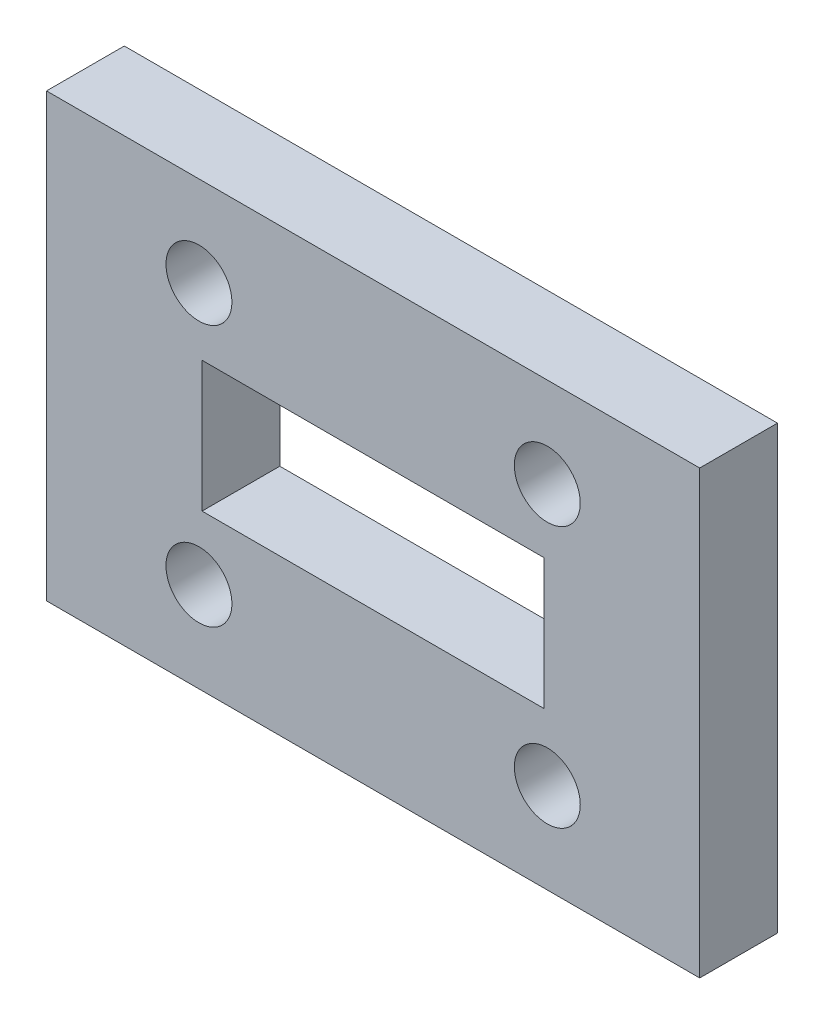
ISO-10303-21;
HEADER;
FILE_DESCRIPTION(('STEP AP214'),'2;1');
FILE_NAME('part.step','',(''),(''),'','','');
FILE_SCHEMA(('AUTOMOTIVE_DESIGN { 1 0 10303 214 1 1 1 1 }'));
ENDSEC;
DATA;
#1=APPLICATION_CONTEXT('core data for automotive mechanical design processes');
#2=APPLICATION_PROTOCOL_DEFINITION('international standard','automotive_design',2000,#1);
#3=PRODUCT_CONTEXT('',#1,'mechanical');
#4=PRODUCT('Part','Part','',(#3));
#5=PRODUCT_RELATED_PRODUCT_CATEGORY('part','',(#4));
#6=PRODUCT_DEFINITION_FORMATION('','',#4);
#7=PRODUCT_DEFINITION_CONTEXT('part definition',#1,'design');
#8=PRODUCT_DEFINITION('design','',#6,#7);
#9=PRODUCT_DEFINITION_SHAPE('','',#8);
#10=(LENGTH_UNIT() NAMED_UNIT(*) SI_UNIT(.MILLI.,.METRE.));
#11=(NAMED_UNIT(*) PLANE_ANGLE_UNIT() SI_UNIT($,.RADIAN.));
#12=(NAMED_UNIT(*) SI_UNIT($,.STERADIAN.) SOLID_ANGLE_UNIT());
#13=UNCERTAINTY_MEASURE_WITH_UNIT(LENGTH_MEASURE(1.E-05),#10,'distance_accuracy_value','');
#14=(GEOMETRIC_REPRESENTATION_CONTEXT(3) GLOBAL_UNCERTAINTY_ASSIGNED_CONTEXT((#13)) GLOBAL_UNIT_ASSIGNED_CONTEXT((#10,
#11,#12)) REPRESENTATION_CONTEXT('',''));
#15=CARTESIAN_POINT('',(0.,0.,0.));
#16=DIRECTION('',(0.,0.,1.));
#17=DIRECTION('',(1.,0.,0.));
#18=AXIS2_PLACEMENT_3D('',#15,#16,#17);
#19=CARTESIAN_POINT('',(0.,0.,3.175));
#20=DIRECTION('',(0.,0.,1.));
#21=DIRECTION('',(1.,0.,0.));
#22=AXIS2_PLACEMENT_3D('',#19,#20,#21);
#23=PLANE('',#22);
#24=CARTESIAN_POINT('',(7.112,-5.334,3.175));
#25=DIRECTION('',(0.,0.,1.));
#26=DIRECTION('',(1.,0.,0.));
#27=AXIS2_PLACEMENT_3D('',#24,#25,#26);
#28=CIRCLE('',#27,1.3462);
#29=CARTESIAN_POINT('',(8.4582,-5.334,3.175));
#30=VERTEX_POINT('',#29);
#31=EDGE_CURVE('E277',#30,#30,#28,.T.);
#32=ORIENTED_EDGE('',*,*,#31,.F.);
#33=EDGE_LOOP('',(#32));
#34=FACE_BOUND('',#33,.T.);
#35=CARTESIAN_POINT('',(-7.112,5.334,3.175));
#36=DIRECTION('',(0.,0.,1.));
#37=DIRECTION('',(1.,0.,0.));
#38=AXIS2_PLACEMENT_3D('',#35,#36,#37);
#39=CIRCLE('',#38,1.3462);
#40=CARTESIAN_POINT('',(-5.7658,5.334,3.175));
#41=VERTEX_POINT('',#40);
#42=EDGE_CURVE('E140',#41,#41,#39,.T.);
#43=ORIENTED_EDGE('',*,*,#42,.F.);
#44=EDGE_LOOP('',(#43));
#45=FACE_BOUND('',#44,.T.);
#46=DIRECTION('',(0.,-1.,0.));
#47=VECTOR('',#46,1.);
#48=CARTESIAN_POINT('',(-13.335,-9.017,3.175));
#49=LINE('',#48,#47);
#50=CARTESIAN_POINT('',(-13.335,9.017,3.175));
#51=VERTEX_POINT('',#50);
#52=CARTESIAN_POINT('',(-13.335,-9.017,3.175));
#53=VERTEX_POINT('',#52);
#54=EDGE_CURVE('E156',#51,#53,#49,.T.);
#55=ORIENTED_EDGE('',*,*,#54,.T.);
#56=DIRECTION('',(1.,0.,0.));
#57=VECTOR('',#56,1.);
#58=CARTESIAN_POINT('',(13.335,-9.01699999999999,3.175));
#59=LINE('',#58,#57);
#60=CARTESIAN_POINT('',(13.335,-9.01699999999999,3.175));
#61=VERTEX_POINT('',#60);
#62=EDGE_CURVE('E160',#53,#61,#59,.T.);
#63=ORIENTED_EDGE('',*,*,#62,.T.);
#64=DIRECTION('',(0.,1.,0.));
#65=VECTOR('',#64,1.);
#66=CARTESIAN_POINT('',(13.335,-9.01699999999999,3.175));
#67=LINE('',#66,#65);
#68=CARTESIAN_POINT('',(13.335,9.01699999999999,3.175));
#69=VERTEX_POINT('',#68);
#70=EDGE_CURVE('E164',#61,#69,#67,.T.);
#71=ORIENTED_EDGE('',*,*,#70,.T.);
#72=DIRECTION('',(-1.,0.,0.));
#73=VECTOR('',#72,1.);
#74=CARTESIAN_POINT('',(13.335,9.01699999999999,3.175));
#75=LINE('',#74,#73);
#76=EDGE_CURVE('E167',#69,#51,#75,.T.);
#77=ORIENTED_EDGE('',*,*,#76,.T.);
#78=EDGE_LOOP('',(#55,#63,#71,#77));
#79=FACE_BOUND('',#78,.T.);
#80=DIRECTION('',(1.,0.,0.));
#81=VECTOR('',#80,1.);
#82=CARTESIAN_POINT('',(6.985,-2.667,3.175));
#83=LINE('',#82,#81);
#84=CARTESIAN_POINT('',(-6.985,-2.667,3.175));
#85=VERTEX_POINT('',#84);
#86=CARTESIAN_POINT('',(6.985,-2.667,3.175));
#87=VERTEX_POINT('',#86);
#88=EDGE_CURVE('E114',#85,#87,#83,.T.);
#89=ORIENTED_EDGE('',*,*,#88,.F.);
#90=DIRECTION('',(0.,-1.,0.));
#91=VECTOR('',#90,1.);
#92=CARTESIAN_POINT('',(-6.985,-2.667,3.175));
#93=LINE('',#92,#91);
#94=CARTESIAN_POINT('',(-6.985,2.667,3.175));
#95=VERTEX_POINT('',#94);
#96=EDGE_CURVE('E105',#95,#85,#93,.T.);
#97=ORIENTED_EDGE('',*,*,#96,.F.);
#98=DIRECTION('',(-1.,0.,0.));
#99=VECTOR('',#98,1.);
#100=CARTESIAN_POINT('',(6.985,2.667,3.175));
#101=LINE('',#100,#99);
#102=CARTESIAN_POINT('',(6.985,2.667,3.175));
#103=VERTEX_POINT('',#102);
#104=EDGE_CURVE('E132',#103,#95,#101,.T.);
#105=ORIENTED_EDGE('',*,*,#104,.F.);
#106=DIRECTION('',(0.,1.,0.));
#107=VECTOR('',#106,1.);
#108=CARTESIAN_POINT('',(6.985,-2.667,3.175));
#109=LINE('',#108,#107);
#110=EDGE_CURVE('E128',#87,#103,#109,.T.);
#111=ORIENTED_EDGE('',*,*,#110,.F.);
#112=EDGE_LOOP('',(#89,#97,#105,#111));
#113=FACE_BOUND('',#112,.T.);
#114=CARTESIAN_POINT('',(7.112,5.334,3.175));
#115=DIRECTION('',(0.,0.,1.));
#116=DIRECTION('',(-1.,0.,0.));
#117=AXIS2_PLACEMENT_3D('',#114,#115,#116);
#118=CIRCLE('',#117,1.3462);
#119=CARTESIAN_POINT('',(5.7658,5.334,3.175));
#120=VERTEX_POINT('',#119);
#121=EDGE_CURVE('E285',#120,#120,#118,.T.);
#122=ORIENTED_EDGE('',*,*,#121,.F.);
#123=EDGE_LOOP('',(#122));
#124=FACE_BOUND('',#123,.T.);
#125=CARTESIAN_POINT('',(-7.112,-5.334,3.175));
#126=DIRECTION('',(0.,0.,1.));
#127=DIRECTION('',(-1.,0.,0.));
#128=AXIS2_PLACEMENT_3D('',#125,#126,#127);
#129=CIRCLE('',#128,1.3462);
#130=CARTESIAN_POINT('',(-8.4582,-5.334,3.175));
#131=VERTEX_POINT('',#130);
#132=EDGE_CURVE('E266',#131,#131,#129,.T.);
#133=ORIENTED_EDGE('',*,*,#132,.F.);
#134=EDGE_LOOP('',(#133));
#135=FACE_BOUND('',#134,.T.);
#136=ADVANCED_FACE('F39',(#34,#45,#79,#113,#124,#135),#23,.T.);
#137=CARTESIAN_POINT('',(0.,0.,0.));
#138=DIRECTION('',(0.,0.,1.));
#139=DIRECTION('',(1.,0.,0.));
#140=AXIS2_PLACEMENT_3D('',#137,#138,#139);
#141=PLANE('',#140);
#142=DIRECTION('',(0.,-1.,0.));
#143=VECTOR('',#142,1.);
#144=CARTESIAN_POINT('',(-13.335,-9.017,0.));
#145=LINE('',#144,#143);
#146=CARTESIAN_POINT('',(-13.335,9.017,0.));
#147=VERTEX_POINT('',#146);
#148=CARTESIAN_POINT('',(-13.335,-9.017,0.));
#149=VERTEX_POINT('',#148);
#150=EDGE_CURVE('E123',#147,#149,#145,.T.);
#151=ORIENTED_EDGE('',*,*,#150,.F.);
#152=DIRECTION('',(-1.,0.,0.));
#153=VECTOR('',#152,1.);
#154=CARTESIAN_POINT('',(13.335,9.01699999999999,0.));
#155=LINE('',#154,#153);
#156=CARTESIAN_POINT('',(13.335,9.01699999999999,0.));
#157=VERTEX_POINT('',#156);
#158=EDGE_CURVE('E161',#157,#147,#155,.T.);
#159=ORIENTED_EDGE('',*,*,#158,.F.);
#160=DIRECTION('',(0.,1.,0.));
#161=VECTOR('',#160,1.);
#162=CARTESIAN_POINT('',(13.335,-9.01699999999999,0.));
#163=LINE('',#162,#161);
#164=CARTESIAN_POINT('',(13.335,-9.01699999999999,0.));
#165=VERTEX_POINT('',#164);
#166=EDGE_CURVE('E177',#165,#157,#163,.T.);
#167=ORIENTED_EDGE('',*,*,#166,.F.);
#168=DIRECTION('',(1.,0.,0.));
#169=VECTOR('',#168,1.);
#170=CARTESIAN_POINT('',(13.335,-9.01699999999999,0.));
#171=LINE('',#170,#169);
#172=EDGE_CURVE('E174',#149,#165,#171,.T.);
#173=ORIENTED_EDGE('',*,*,#172,.F.);
#174=EDGE_LOOP('',(#151,#159,#167,#173));
#175=FACE_BOUND('',#174,.T.);
#176=DIRECTION('',(0.,-1.,0.));
#177=VECTOR('',#176,1.);
#178=CARTESIAN_POINT('',(-6.985,-2.667,0.));
#179=LINE('',#178,#177);
#180=CARTESIAN_POINT('',(-6.985,2.667,0.));
#181=VERTEX_POINT('',#180);
#182=CARTESIAN_POINT('',(-6.985,-2.667,0.));
#183=VERTEX_POINT('',#182);
#184=EDGE_CURVE('E63',#181,#183,#179,.T.);
#185=ORIENTED_EDGE('',*,*,#184,.T.);
#186=DIRECTION('',(1.,0.,0.));
#187=VECTOR('',#186,1.);
#188=CARTESIAN_POINT('',(6.985,-2.667,0.));
#189=LINE('',#188,#187);
#190=CARTESIAN_POINT('',(6.985,-2.667,0.));
#191=VERTEX_POINT('',#190);
#192=EDGE_CURVE('E121',#183,#191,#189,.T.);
#193=ORIENTED_EDGE('',*,*,#192,.T.);
#194=DIRECTION('',(0.,1.,0.));
#195=VECTOR('',#194,1.);
#196=CARTESIAN_POINT('',(6.985,-2.667,0.));
#197=LINE('',#196,#195);
#198=CARTESIAN_POINT('',(6.985,2.667,0.));
#199=VERTEX_POINT('',#198);
#200=EDGE_CURVE('E143',#191,#199,#197,.T.);
#201=ORIENTED_EDGE('',*,*,#200,.T.);
#202=DIRECTION('',(-1.,0.,0.));
#203=VECTOR('',#202,1.);
#204=CARTESIAN_POINT('',(6.985,2.667,0.));
#205=LINE('',#204,#203);
#206=EDGE_CURVE('E115',#199,#181,#205,.T.);
#207=ORIENTED_EDGE('',*,*,#206,.T.);
#208=EDGE_LOOP('',(#185,#193,#201,#207));
#209=FACE_BOUND('',#208,.T.);
#210=CARTESIAN_POINT('',(-7.112,5.334,0.));
#211=DIRECTION('',(0.,0.,1.));
#212=DIRECTION('',(1.,0.,0.));
#213=AXIS2_PLACEMENT_3D('',#210,#211,#212);
#214=CIRCLE('',#213,1.3462);
#215=CARTESIAN_POINT('',(-5.7658,5.334,0.));
#216=VERTEX_POINT('',#215);
#217=EDGE_CURVE('E289',#216,#216,#214,.T.);
#218=ORIENTED_EDGE('',*,*,#217,.T.);
#219=EDGE_LOOP('',(#218));
#220=FACE_BOUND('',#219,.T.);
#221=CARTESIAN_POINT('',(7.112,5.334,0.));
#222=DIRECTION('',(0.,0.,1.));
#223=DIRECTION('',(-1.,0.,0.));
#224=AXIS2_PLACEMENT_3D('',#221,#222,#223);
#225=CIRCLE('',#224,1.3462);
#226=CARTESIAN_POINT('',(5.7658,5.334,0.));
#227=VERTEX_POINT('',#226);
#228=EDGE_CURVE('E281',#227,#227,#225,.T.);
#229=ORIENTED_EDGE('',*,*,#228,.T.);
#230=EDGE_LOOP('',(#229));
#231=FACE_BOUND('',#230,.T.);
#232=CARTESIAN_POINT('',(7.112,-5.334,0.));
#233=DIRECTION('',(0.,0.,1.));
#234=DIRECTION('',(1.,0.,0.));
#235=AXIS2_PLACEMENT_3D('',#232,#233,#234);
#236=CIRCLE('',#235,1.3462);
#237=CARTESIAN_POINT('',(8.4582,-5.334,0.));
#238=VERTEX_POINT('',#237);
#239=EDGE_CURVE('E274',#238,#238,#236,.T.);
#240=ORIENTED_EDGE('',*,*,#239,.T.);
#241=EDGE_LOOP('',(#240));
#242=FACE_BOUND('',#241,.T.);
#243=CARTESIAN_POINT('',(-7.112,-5.334,0.));
#244=DIRECTION('',(0.,0.,1.));
#245=DIRECTION('',(-1.,0.,0.));
#246=AXIS2_PLACEMENT_3D('',#243,#244,#245);
#247=CIRCLE('',#246,1.3462);
#248=CARTESIAN_POINT('',(-8.4582,-5.334,0.));
#249=VERTEX_POINT('',#248);
#250=EDGE_CURVE('E269',#249,#249,#247,.T.);
#251=ORIENTED_EDGE('',*,*,#250,.T.);
#252=EDGE_LOOP('',(#251));
#253=FACE_BOUND('',#252,.T.);
#254=ADVANCED_FACE('F200',(#175,#209,#220,#231,#242,#253),#141,.F.);
#255=CARTESIAN_POINT('',(-13.335,-9.017,3.175));
#256=DIRECTION('',(1.,0.,0.));
#257=DIRECTION('',(0.,0.,-1.));
#258=AXIS2_PLACEMENT_3D('',#255,#256,#257);
#259=PLANE('',#258);
#260=ORIENTED_EDGE('',*,*,#150,.T.);
#261=DIRECTION('',(0.,0.,-1.));
#262=VECTOR('',#261,1.);
#263=CARTESIAN_POINT('',(-13.335,-9.017,3.175));
#264=LINE('',#263,#262);
#265=EDGE_CURVE('E11',#53,#149,#264,.T.);
#266=ORIENTED_EDGE('',*,*,#265,.F.);
#267=ORIENTED_EDGE('',*,*,#54,.F.);
#268=DIRECTION('',(0.,0.,-1.));
#269=VECTOR('',#268,1.);
#270=CARTESIAN_POINT('',(-13.335,9.017,3.175));
#271=LINE('',#270,#269);
#272=EDGE_CURVE('E170',#51,#147,#271,.T.);
#273=ORIENTED_EDGE('',*,*,#272,.T.);
#274=EDGE_LOOP('',(#260,#266,#267,#273));
#275=FACE_BOUND('',#274,.T.);
#276=ADVANCED_FACE('F41',(#275),#259,.F.);
#277=CARTESIAN_POINT('',(13.335,-9.01699999999999,3.175));
#278=DIRECTION('',(0.,1.,0.));
#279=DIRECTION('',(-1.,0.,0.));
#280=AXIS2_PLACEMENT_3D('',#277,#278,#279);
#281=PLANE('',#280);
#282=ORIENTED_EDGE('',*,*,#172,.T.);
#283=DIRECTION('',(0.,0.,-1.));
#284=VECTOR('',#283,1.);
#285=CARTESIAN_POINT('',(13.335,-9.01699999999999,3.175));
#286=LINE('',#285,#284);
#287=EDGE_CURVE('E48',#61,#165,#286,.T.);
#288=ORIENTED_EDGE('',*,*,#287,.F.);
#289=ORIENTED_EDGE('',*,*,#62,.F.);
#290=ORIENTED_EDGE('',*,*,#265,.T.);
#291=EDGE_LOOP('',(#282,#288,#289,#290));
#292=FACE_BOUND('',#291,.T.);
#293=ADVANCED_FACE('F210',(#292),#281,.F.);
#294=CARTESIAN_POINT('',(13.335,-9.01699999999999,3.175));
#295=DIRECTION('',(-1.,0.,0.));
#296=DIRECTION('',(0.,0.,1.));
#297=AXIS2_PLACEMENT_3D('',#294,#295,#296);
#298=PLANE('',#297);
#299=ORIENTED_EDGE('',*,*,#166,.T.);
#300=DIRECTION('',(0.,0.,-1.));
#301=VECTOR('',#300,1.);
#302=CARTESIAN_POINT('',(13.335,9.01699999999999,3.175));
#303=LINE('',#302,#301);
#304=EDGE_CURVE('E185',#69,#157,#303,.T.);
#305=ORIENTED_EDGE('',*,*,#304,.F.);
#306=ORIENTED_EDGE('',*,*,#70,.F.);
#307=ORIENTED_EDGE('',*,*,#287,.T.);
#308=EDGE_LOOP('',(#299,#305,#306,#307));
#309=FACE_BOUND('',#308,.T.);
#310=ADVANCED_FACE('F194',(#309),#298,.F.);
#311=CARTESIAN_POINT('',(13.335,9.01699999999999,3.175));
#312=DIRECTION('',(0.,-1.,0.));
#313=DIRECTION('',(1.,0.,0.));
#314=AXIS2_PLACEMENT_3D('',#311,#312,#313);
#315=PLANE('',#314);
#316=ORIENTED_EDGE('',*,*,#158,.T.);
#317=ORIENTED_EDGE('',*,*,#272,.F.);
#318=ORIENTED_EDGE('',*,*,#76,.F.);
#319=ORIENTED_EDGE('',*,*,#304,.T.);
#320=EDGE_LOOP('',(#316,#317,#318,#319));
#321=FACE_BOUND('',#320,.T.);
#322=ADVANCED_FACE('F204',(#321),#315,.F.);
#323=CARTESIAN_POINT('',(-6.985,-2.667,3.175));
#324=DIRECTION('',(1.,0.,0.));
#325=DIRECTION('',(0.,0.,-1.));
#326=AXIS2_PLACEMENT_3D('',#323,#324,#325);
#327=PLANE('',#326);
#328=ORIENTED_EDGE('',*,*,#184,.F.);
#329=DIRECTION('',(0.,0.,-1.));
#330=VECTOR('',#329,1.);
#331=CARTESIAN_POINT('',(-6.985,2.667,3.175));
#332=LINE('',#331,#330);
#333=EDGE_CURVE('E109',#95,#181,#332,.T.);
#334=ORIENTED_EDGE('',*,*,#333,.F.);
#335=ORIENTED_EDGE('',*,*,#96,.T.);
#336=DIRECTION('',(0.,0.,-1.));
#337=VECTOR('',#336,1.);
#338=CARTESIAN_POINT('',(-6.985,-2.667,3.175));
#339=LINE('',#338,#337);
#340=EDGE_CURVE('E108',#85,#183,#339,.T.);
#341=ORIENTED_EDGE('',*,*,#340,.T.);
#342=EDGE_LOOP('',(#328,#334,#335,#341));
#343=FACE_BOUND('',#342,.T.);
#344=ADVANCED_FACE('F107',(#343),#327,.T.);
#345=CARTESIAN_POINT('',(6.985,-2.667,3.175));
#346=DIRECTION('',(0.,1.,0.));
#347=DIRECTION('',(-1.,0.,0.));
#348=AXIS2_PLACEMENT_3D('',#345,#346,#347);
#349=PLANE('',#348);
#350=ORIENTED_EDGE('',*,*,#192,.F.);
#351=ORIENTED_EDGE('',*,*,#340,.F.);
#352=ORIENTED_EDGE('',*,*,#88,.T.);
#353=DIRECTION('',(0.,0.,-1.));
#354=VECTOR('',#353,1.);
#355=CARTESIAN_POINT('',(6.985,-2.667,3.175));
#356=LINE('',#355,#354);
#357=EDGE_CURVE('E124',#87,#191,#356,.T.);
#358=ORIENTED_EDGE('',*,*,#357,.T.);
#359=EDGE_LOOP('',(#350,#351,#352,#358));
#360=FACE_BOUND('',#359,.T.);
#361=ADVANCED_FACE('F118',(#360),#349,.T.);
#362=CARTESIAN_POINT('',(6.985,-2.667,3.175));
#363=DIRECTION('',(-1.,0.,0.));
#364=DIRECTION('',(0.,0.,1.));
#365=AXIS2_PLACEMENT_3D('',#362,#363,#364);
#366=PLANE('',#365);
#367=ORIENTED_EDGE('',*,*,#200,.F.);
#368=ORIENTED_EDGE('',*,*,#357,.F.);
#369=ORIENTED_EDGE('',*,*,#110,.T.);
#370=DIRECTION('',(0.,0.,-1.));
#371=VECTOR('',#370,1.);
#372=CARTESIAN_POINT('',(6.985,2.667,3.175));
#373=LINE('',#372,#371);
#374=EDGE_CURVE('E55',#103,#199,#373,.T.);
#375=ORIENTED_EDGE('',*,*,#374,.T.);
#376=EDGE_LOOP('',(#367,#368,#369,#375));
#377=FACE_BOUND('',#376,.T.);
#378=ADVANCED_FACE('F236',(#377),#366,.T.);
#379=CARTESIAN_POINT('',(6.985,2.667,3.175));
#380=DIRECTION('',(0.,-1.,0.));
#381=DIRECTION('',(1.,0.,0.));
#382=AXIS2_PLACEMENT_3D('',#379,#380,#381);
#383=PLANE('',#382);
#384=ORIENTED_EDGE('',*,*,#206,.F.);
#385=ORIENTED_EDGE('',*,*,#374,.F.);
#386=ORIENTED_EDGE('',*,*,#104,.T.);
#387=ORIENTED_EDGE('',*,*,#333,.T.);
#388=EDGE_LOOP('',(#384,#385,#386,#387));
#389=FACE_BOUND('',#388,.T.);
#390=ADVANCED_FACE('F240',(#389),#383,.T.);
#391=CARTESIAN_POINT('',(-7.112,5.334,3.175));
#392=DIRECTION('',(0.,0.,-1.));
#393=DIRECTION('',(-1.,0.,0.));
#394=AXIS2_PLACEMENT_3D('',#391,#392,#393);
#395=CYLINDRICAL_SURFACE('',#394,1.3462);
#396=ORIENTED_EDGE('',*,*,#42,.T.);
#397=EDGE_LOOP('',(#396));
#398=FACE_BOUND('',#397,.T.);
#399=ORIENTED_EDGE('',*,*,#217,.F.);
#400=EDGE_LOOP('',(#399));
#401=FACE_BOUND('',#400,.T.);
#402=ADVANCED_FACE('F246',(#398,#401),#395,.F.);
#403=CARTESIAN_POINT('',(7.112,5.334,3.175));
#404=DIRECTION('',(0.,0.,-1.));
#405=DIRECTION('',(-1.,0.,0.));
#406=AXIS2_PLACEMENT_3D('',#403,#404,#405);
#407=CYLINDRICAL_SURFACE('',#406,1.3462);
#408=ORIENTED_EDGE('',*,*,#121,.T.);
#409=EDGE_LOOP('',(#408));
#410=FACE_BOUND('',#409,.T.);
#411=ORIENTED_EDGE('',*,*,#228,.F.);
#412=EDGE_LOOP('',(#411));
#413=FACE_BOUND('',#412,.T.);
#414=ADVANCED_FACE('F249',(#410,#413),#407,.F.);
#415=CARTESIAN_POINT('',(7.112,-5.334,3.175));
#416=DIRECTION('',(0.,0.,-1.));
#417=DIRECTION('',(-1.,0.,0.));
#418=AXIS2_PLACEMENT_3D('',#415,#416,#417);
#419=CYLINDRICAL_SURFACE('',#418,1.3462);
#420=ORIENTED_EDGE('',*,*,#31,.T.);
#421=EDGE_LOOP('',(#420));
#422=FACE_BOUND('',#421,.T.);
#423=ORIENTED_EDGE('',*,*,#239,.F.);
#424=EDGE_LOOP('',(#423));
#425=FACE_BOUND('',#424,.T.);
#426=ADVANCED_FACE('F253',(#422,#425),#419,.F.);
#427=CARTESIAN_POINT('',(-7.112,-5.334,3.175));
#428=DIRECTION('',(0.,0.,-1.));
#429=DIRECTION('',(-1.,0.,0.));
#430=AXIS2_PLACEMENT_3D('',#427,#428,#429);
#431=CYLINDRICAL_SURFACE('',#430,1.3462);
#432=ORIENTED_EDGE('',*,*,#132,.T.);
#433=EDGE_LOOP('',(#432));
#434=FACE_BOUND('',#433,.T.);
#435=ORIENTED_EDGE('',*,*,#250,.F.);
#436=EDGE_LOOP('',(#435));
#437=FACE_BOUND('',#436,.T.);
#438=ADVANCED_FACE('F257',(#434,#437),#431,.F.);
#439=CLOSED_SHELL('',(#136,#254,#276,#293,#310,#322,#344,#361,#378,#390,#402,#414,#426,#438));
#440=MANIFOLD_SOLID_BREP('B2',#439);
#441=ADVANCED_BREP_SHAPE_REPRESENTATION('',(#18,#440),#14);
#442=SHAPE_DEFINITION_REPRESENTATION(#9,#441);
ENDSEC;
END-ISO-10303-21;
